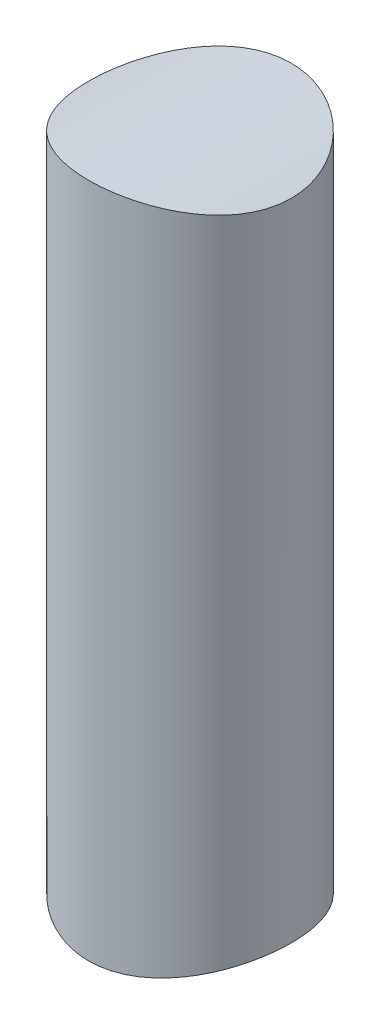
ISO-10303-21;
HEADER;
FILE_DESCRIPTION(('STEP AP214'),'2;1');
FILE_NAME('part.step','',(''),(''),'','','');
FILE_SCHEMA(('AUTOMOTIVE_DESIGN { 1 0 10303 214 1 1 1 1 }'));
ENDSEC;
DATA;
#1=APPLICATION_CONTEXT('core data for automotive mechanical design processes');
#2=APPLICATION_PROTOCOL_DEFINITION('international standard','automotive_design',2000,#1);
#3=PRODUCT_CONTEXT('',#1,'mechanical');
#4=PRODUCT('Part','Part','',(#3));
#5=PRODUCT_RELATED_PRODUCT_CATEGORY('part','',(#4));
#6=PRODUCT_DEFINITION_FORMATION('','',#4);
#7=PRODUCT_DEFINITION_CONTEXT('part definition',#1,'design');
#8=PRODUCT_DEFINITION('design','',#6,#7);
#9=PRODUCT_DEFINITION_SHAPE('','',#8);
#10=(LENGTH_UNIT() NAMED_UNIT(*) SI_UNIT(.MILLI.,.METRE.));
#11=(NAMED_UNIT(*) PLANE_ANGLE_UNIT() SI_UNIT($,.RADIAN.));
#12=(NAMED_UNIT(*) SI_UNIT($,.STERADIAN.) SOLID_ANGLE_UNIT());
#13=UNCERTAINTY_MEASURE_WITH_UNIT(LENGTH_MEASURE(1.E-05),#10,'distance_accuracy_value','');
#14=(GEOMETRIC_REPRESENTATION_CONTEXT(3) GLOBAL_UNCERTAINTY_ASSIGNED_CONTEXT((#13)) GLOBAL_UNIT_ASSIGNED_CONTEXT((#10,
#11,#12)) REPRESENTATION_CONTEXT('',''));
#15=CARTESIAN_POINT('',(0.,0.,0.));
#16=DIRECTION('',(0.,0.,1.));
#17=DIRECTION('',(1.,0.,0.));
#18=AXIS2_PLACEMENT_3D('',#15,#16,#17);
#19=CARTESIAN_POINT('',(0.,0.,5.));
#20=DIRECTION('',(0.,0.,-1.));
#21=DIRECTION('',(-1.,0.,0.));
#22=AXIS2_PLACEMENT_3D('',#19,#20,#21);
#23=CYLINDRICAL_SURFACE('',#22,2.5);
#24=CARTESIAN_POINT('',(0.,2.5,3.25));
#25=CARTESIAN_POINT('',(-0.04114430637665,2.49999964625275,3.24999950125756));
#26=CARTESIAN_POINT('',(-0.0822936591757648,2.49897457846979,3.24660306818802));
#27=CARTESIAN_POINT('',(-0.16339406265244,2.49498552796844,3.23313932288895));
#28=CARTESIAN_POINT('',(-0.20334475220571,2.49202096694839,3.22307002098833));
#29=CARTESIAN_POINT('',(-0.280866353877264,2.48447776250925,3.19662699154487));
#30=CARTESIAN_POINT('',(-0.318440682197688,2.47990150125239,3.18026256519052));
#31=CARTESIAN_POINT('',(-0.390312090526564,2.46961054618796,3.14173195347209));
#32=CARTESIAN_POINT('',(-0.42460873373483,2.46389570095935,3.11956499630233));
#33=CARTESIAN_POINT('',(-0.489935898591878,2.45175368596488,3.06938799626363));
#34=CARTESIAN_POINT('',(-0.52085903562219,2.445311918289,3.0412416870569));
#35=CARTESIAN_POINT('',(-0.577624604616599,2.43252917104839,2.98019538504505));
#36=CARTESIAN_POINT('',(-0.603466181637131,2.42618820860824,2.94729459393805));
#37=CARTESIAN_POINT('',(-0.649900188618613,2.41417056998345,2.87676462348066));
#38=CARTESIAN_POINT('',(-0.67036154511135,2.4085120333744,2.8390457695026));
#39=CARTESIAN_POINT('',(-0.704606973873519,2.39871810191514,2.76050537288688));
#40=CARTESIAN_POINT('',(-0.71839264959881,2.39458234136111,2.71968457804358));
#41=CARTESIAN_POINT('',(-0.738508168412816,2.38845435439231,2.63730486693343));
#42=CARTESIAN_POINT('',(-0.745035981175235,2.38640534735888,2.59579862805323));
#43=CARTESIAN_POINT('',(-0.751068653075396,2.38451394948142,2.51223342187363));
#44=CARTESIAN_POINT('',(-0.750575213805359,2.38467102399598,2.47017459096274));
#45=CARTESIAN_POINT('',(-0.742734885998503,2.38712372015292,2.38830804569707));
#46=CARTESIAN_POINT('',(-0.735636026313277,2.38934194294585,2.34847387481923));
#47=CARTESIAN_POINT('',(-0.715187102135428,2.39554178119298,2.27059010686292));
#48=CARTESIAN_POINT('',(-0.701836420708244,2.3995235706752,2.23254068631274));
#49=CARTESIAN_POINT('',(-0.669080133268367,2.40886366536124,2.15869982516973));
#50=CARTESIAN_POINT('',(-0.649594084673201,2.4142400805761,2.12294645802239));
#51=CARTESIAN_POINT('',(-0.605176112943427,2.42575493500398,2.05513398899488));
#52=CARTESIAN_POINT('',(-0.580242870012945,2.43189355873595,2.0230757852931));
#53=CARTESIAN_POINT('',(-0.524406453827728,2.44455505648865,1.962156904619));
#54=CARTESIAN_POINT('',(-0.493297453733485,2.45108327155221,1.93348566798517));
#55=CARTESIAN_POINT('',(-0.426631629656984,2.46356122031657,1.88172300796787));
#56=CARTESIAN_POINT('',(-0.391074525930444,2.46951091759212,1.85863193579279));
#57=CARTESIAN_POINT('',(-0.316177519171401,2.48021580034728,1.81857003876763));
#58=CARTESIAN_POINT('',(-0.276813874873975,2.48496271834155,1.80164124187507));
#59=CARTESIAN_POINT('',(-0.19562270780176,2.49266760916113,1.77470020495018));
#60=CARTESIAN_POINT('',(-0.153795875794791,2.495626080935,1.76468603573375));
#61=CARTESIAN_POINT('',(-0.0704761213341656,2.49934182321769,1.7521739110503));
#62=CARTESIAN_POINT('',(-0.029025048800593,2.50017425208896,1.7494192070992));
#63=CARTESIAN_POINT('',(0.0537498029116911,2.49976461620879,1.75078457785604));
#64=CARTESIAN_POINT('',(0.0950735983453889,2.49852282838873,1.75490373482572));
#65=CARTESIAN_POINT('',(0.17545180265485,2.49415348493587,1.76969230555575));
#66=CARTESIAN_POINT('',(0.21453638630709,2.49106914899727,1.78021169379045));
#67=CARTESIAN_POINT('',(0.290377319477255,2.48337173920747,1.80732161638909));
#68=CARTESIAN_POINT('',(0.327133388512771,2.47875848160472,1.82391288051888));
#69=CARTESIAN_POINT('',(0.398218594730547,2.46834827175735,1.86312658274062));
#70=CARTESIAN_POINT('',(0.432471913099914,2.4625264041511,1.8858796704742));
#71=CARTESIAN_POINT('',(0.496761653989994,2.45036734381886,1.9366123770262));
#72=CARTESIAN_POINT('',(0.526797016177672,2.44403002214522,1.96459330594305));
#73=CARTESIAN_POINT('',(0.58292872275544,2.43126585935624,2.02619365418548));
#74=CARTESIAN_POINT('',(0.608842406158679,2.42484412520639,2.05998093788894));
#75=CARTESIAN_POINT('',(0.654644975359606,2.41288257615227,2.13156396950369));
#76=CARTESIAN_POINT('',(0.67453401914302,2.40734273812361,2.16935961226761));
#77=CARTESIAN_POINT('',(0.707586735638617,2.39783594822466,2.24776624563512));
#78=CARTESIAN_POINT('',(0.720781734698862,2.39386168977456,2.2883630933033));
#79=CARTESIAN_POINT('',(0.740108654089556,2.38795797236724,2.37134398450277));
#80=CARTESIAN_POINT('',(0.746242994897492,2.38602781268684,2.41372741040567));
#81=CARTESIAN_POINT('',(0.751109922422095,2.38449986234108,2.497180759181));
#82=CARTESIAN_POINT('',(0.750140276541593,2.38480823717645,2.53823182550689));
#83=CARTESIAN_POINT('',(0.741537527224924,2.38749700647879,2.6195570516883));
#84=CARTESIAN_POINT('',(0.733904690623809,2.3898773179727,2.65983124258868));
#85=CARTESIAN_POINT('',(0.712384444020455,2.39637881834211,2.73797269957092));
#86=CARTESIAN_POINT('',(0.698575877535282,2.40047802272719,2.77586364368071));
#87=CARTESIAN_POINT('',(0.665157535605707,2.40995139454832,2.848821219409));
#88=CARTESIAN_POINT('',(0.645546649814398,2.41532580597228,2.88388730882042));
#89=CARTESIAN_POINT('',(0.600243819025343,2.42698838212842,2.95158155826352));
#90=CARTESIAN_POINT('',(0.574356380464964,2.43330270081879,2.9840743806302));
#91=CARTESIAN_POINT('',(0.517587173148914,2.44600660225033,3.04435124915394));
#92=CARTESIAN_POINT('',(0.486704108567252,2.45239620411958,3.07213406973388));
#93=CARTESIAN_POINT('',(0.419732881091623,2.46475468285319,3.12301170614751));
#94=CARTESIAN_POINT('',(0.383518942895303,2.47070579882836,3.14594572342774));
#95=CARTESIAN_POINT('',(0.307570686991765,2.48130340227908,3.18536758495201));
#96=CARTESIAN_POINT('',(0.267838026499477,2.48595049965534,3.20185844413726));
#97=CARTESIAN_POINT('',(0.19037885632764,2.4930108748465,3.22644763782638));
#98=CARTESIAN_POINT('',(0.152893480977116,2.49561013690534,3.23525583644162));
#99=CARTESIAN_POINT('',(0.0769400976153893,2.49910472247246,3.24703176262079));
#100=CARTESIAN_POINT('',(0.0384722549290696,2.5000003307737,3.25000046635241));
#101=CARTESIAN_POINT('',(0.,2.5,3.25));
#102=B_SPLINE_CURVE_WITH_KNOTS('',3,(#24,#25,#26,#27,#28,#29,#30,#31,#32,#33,#34,#35,#36,#37,
#38,#39,#40,#41,#42,#43,#44,#45,#46,#47,#48,#49,#50,#51,#52,#53,#54,#55,#56,#57,#58,#59,#60,#61,
#62,#63,#64,#65,#66,#67,#68,#69,#70,#71,#72,#73,#74,#75,#76,#77,#78,#79,#80,#81,#82,#83,#84,#85,
#86,#87,#88,#89,#90,#91,#92,#93,#94,#95,#96,#97,#98,#99,#100,#101),.UNSPECIFIED.,.T.,.F.,(4,2,2,
2,2,2,2,2,2,2,2,2,2,2,2,2,2,2,2,2,2,2,2,2,2,2,2,2,2,2,2,2,2,2,2,2,2,2,4),(0.,0.123291601806305,
0.246619982423,0.369766838150437,0.492930082206351,0.619278014740958,0.745647186443165,
0.874857405020545,1.00403657271612,1.12959844676438,1.25512989155768,1.37613008345061,
1.49714221825224,1.61981213219783,1.74251180075501,1.87033552020306,1.99816728261759,
2.12685523437067,2.25550726760627,2.37954404715496,2.50356426771387,2.62478373337387,
2.74601777293087,2.87005652847677,2.99412640996319,3.12270200157632,3.25127422122563,
3.37923907470651,3.50716004723841,3.6297507772717,3.75233659824499,3.8734002019506,
3.99448698770253,4.11998462833664,4.2455148744245,4.37471498072034,4.50385455791317,
4.61915845958929,4.73444308468136),.UNSPECIFIED.);
#103=CARTESIAN_POINT('',(0.,2.5,3.25));
#104=VERTEX_POINT('',#103);
#105=EDGE_CURVE('E46',#104,#104,#102,.T.);
#106=ORIENTED_EDGE('',*,*,#105,.F.);
#107=EDGE_LOOP('',(#106));
#108=FACE_BOUND('',#107,.T.);
#109=ADVANCED_FACE('F35',(#108),#23,.T.);
#110=CARTESIAN_POINT('',(0.,-2.5,2.5));
#111=DIRECTION('',(0.,1.,0.));
#112=DIRECTION('',(0.,0.,1.));
#113=AXIS2_PLACEMENT_3D('',#110,#111,#112);
#114=CYLINDRICAL_SURFACE('',#113,0.75);
#115=ORIENTED_EDGE('',*,*,#105,.T.);
#116=EDGE_LOOP('',(#115));
#117=FACE_BOUND('',#116,.T.);
#118=CARTESIAN_POINT('',(0.,-2.5,3.25));
#119=CARTESIAN_POINT('',(0.04114430637665,-2.49999964625275,3.24999950125756));
#120=CARTESIAN_POINT('',(0.0822936591757648,-2.49897457846979,3.24660306818802));
#121=CARTESIAN_POINT('',(0.16339406265244,-2.49498552796844,3.23313932288895));
#122=CARTESIAN_POINT('',(0.20334475220571,-2.49202096694839,3.22307002098833));
#123=CARTESIAN_POINT('',(0.280866353877264,-2.48447776250925,3.19662699154487));
#124=CARTESIAN_POINT('',(0.318440682197688,-2.47990150125239,3.18026256519052));
#125=CARTESIAN_POINT('',(0.390312090526564,-2.46961054618796,3.14173195347209));
#126=CARTESIAN_POINT('',(0.42460873373483,-2.46389570095935,3.11956499630233));
#127=CARTESIAN_POINT('',(0.489935898591878,-2.45175368596488,3.06938799626363));
#128=CARTESIAN_POINT('',(0.52085903562219,-2.445311918289,3.0412416870569));
#129=CARTESIAN_POINT('',(0.577624604616599,-2.43252917104839,2.98019538504505));
#130=CARTESIAN_POINT('',(0.603466181637131,-2.42618820860824,2.94729459393805));
#131=CARTESIAN_POINT('',(0.649900188618613,-2.41417056998345,2.87676462348066));
#132=CARTESIAN_POINT('',(0.67036154511135,-2.4085120333744,2.8390457695026));
#133=CARTESIAN_POINT('',(0.704606973873519,-2.39871810191514,2.76050537288688));
#134=CARTESIAN_POINT('',(0.71839264959881,-2.39458234136111,2.71968457804358));
#135=CARTESIAN_POINT('',(0.738508168412816,-2.38845435439231,2.63730486693343));
#136=CARTESIAN_POINT('',(0.745035981175235,-2.38640534735888,2.59579862805323));
#137=CARTESIAN_POINT('',(0.751068653075396,-2.38451394948142,2.51223342187363));
#138=CARTESIAN_POINT('',(0.750575213805359,-2.38467102399598,2.47017459096274));
#139=CARTESIAN_POINT('',(0.742734885998503,-2.38712372015292,2.38830804569707));
#140=CARTESIAN_POINT('',(0.735636026313277,-2.38934194294585,2.34847387481923));
#141=CARTESIAN_POINT('',(0.715187102135428,-2.39554178119298,2.27059010686292));
#142=CARTESIAN_POINT('',(0.701836420708244,-2.3995235706752,2.23254068631274));
#143=CARTESIAN_POINT('',(0.669080133268367,-2.40886366536124,2.15869982516973));
#144=CARTESIAN_POINT('',(0.649594084673201,-2.4142400805761,2.12294645802239));
#145=CARTESIAN_POINT('',(0.605176112943427,-2.42575493500398,2.05513398899488));
#146=CARTESIAN_POINT('',(0.580242870012945,-2.43189355873595,2.0230757852931));
#147=CARTESIAN_POINT('',(0.524406453827728,-2.44455505648865,1.962156904619));
#148=CARTESIAN_POINT('',(0.493297453733485,-2.45108327155221,1.93348566798517));
#149=CARTESIAN_POINT('',(0.426631629656984,-2.46356122031657,1.88172300796787));
#150=CARTESIAN_POINT('',(0.391074525930444,-2.46951091759212,1.85863193579279));
#151=CARTESIAN_POINT('',(0.316177519171401,-2.48021580034728,1.81857003876763));
#152=CARTESIAN_POINT('',(0.276813874873975,-2.48496271834155,1.80164124187507));
#153=CARTESIAN_POINT('',(0.19562270780176,-2.49266760916113,1.77470020495018));
#154=CARTESIAN_POINT('',(0.153795875794791,-2.495626080935,1.76468603573375));
#155=CARTESIAN_POINT('',(0.0704761213341656,-2.49934182321769,1.7521739110503));
#156=CARTESIAN_POINT('',(0.029025048800593,-2.50017425208896,1.7494192070992));
#157=CARTESIAN_POINT('',(-0.0537498029116911,-2.49976461620879,1.75078457785604));
#158=CARTESIAN_POINT('',(-0.0950735983453889,-2.49852282838873,1.75490373482572));
#159=CARTESIAN_POINT('',(-0.17545180265485,-2.49415348493587,1.76969230555575));
#160=CARTESIAN_POINT('',(-0.21453638630709,-2.49106914899727,1.78021169379045));
#161=CARTESIAN_POINT('',(-0.290377319477255,-2.48337173920747,1.80732161638909));
#162=CARTESIAN_POINT('',(-0.327133388512771,-2.47875848160472,1.82391288051888));
#163=CARTESIAN_POINT('',(-0.398218594730547,-2.46834827175735,1.86312658274062));
#164=CARTESIAN_POINT('',(-0.432471913099914,-2.4625264041511,1.8858796704742));
#165=CARTESIAN_POINT('',(-0.496761653989994,-2.45036734381886,1.9366123770262));
#166=CARTESIAN_POINT('',(-0.526797016177672,-2.44403002214522,1.96459330594305));
#167=CARTESIAN_POINT('',(-0.58292872275544,-2.43126585935624,2.02619365418548));
#168=CARTESIAN_POINT('',(-0.608842406158679,-2.42484412520639,2.05998093788894));
#169=CARTESIAN_POINT('',(-0.654644975359606,-2.41288257615227,2.13156396950369));
#170=CARTESIAN_POINT('',(-0.67453401914302,-2.40734273812361,2.16935961226761));
#171=CARTESIAN_POINT('',(-0.707586735638617,-2.39783594822466,2.24776624563512));
#172=CARTESIAN_POINT('',(-0.720781734698862,-2.39386168977456,2.2883630933033));
#173=CARTESIAN_POINT('',(-0.740108654089556,-2.38795797236724,2.37134398450277));
#174=CARTESIAN_POINT('',(-0.746242994897492,-2.38602781268684,2.41372741040567));
#175=CARTESIAN_POINT('',(-0.751109922422095,-2.38449986234108,2.497180759181));
#176=CARTESIAN_POINT('',(-0.750140276541593,-2.38480823717645,2.53823182550689));
#177=CARTESIAN_POINT('',(-0.741537527224924,-2.38749700647879,2.6195570516883));
#178=CARTESIAN_POINT('',(-0.733904690623809,-2.3898773179727,2.65983124258868));
#179=CARTESIAN_POINT('',(-0.712384444020455,-2.39637881834211,2.73797269957092));
#180=CARTESIAN_POINT('',(-0.698575877535282,-2.40047802272719,2.77586364368071));
#181=CARTESIAN_POINT('',(-0.665157535605707,-2.40995139454832,2.848821219409));
#182=CARTESIAN_POINT('',(-0.645546649814398,-2.41532580597228,2.88388730882042));
#183=CARTESIAN_POINT('',(-0.600243819025343,-2.42698838212842,2.95158155826352));
#184=CARTESIAN_POINT('',(-0.574356380464964,-2.43330270081879,2.9840743806302));
#185=CARTESIAN_POINT('',(-0.517587173148914,-2.44600660225033,3.04435124915394));
#186=CARTESIAN_POINT('',(-0.486704108567252,-2.45239620411958,3.07213406973388));
#187=CARTESIAN_POINT('',(-0.419732881091623,-2.46475468285319,3.12301170614751));
#188=CARTESIAN_POINT('',(-0.383518942895303,-2.47070579882836,3.14594572342774));
#189=CARTESIAN_POINT('',(-0.307570686991765,-2.48130340227908,3.18536758495201));
#190=CARTESIAN_POINT('',(-0.267838026499477,-2.48595049965534,3.20185844413726));
#191=CARTESIAN_POINT('',(-0.19037885632764,-2.4930108748465,3.22644763782638));
#192=CARTESIAN_POINT('',(-0.152893480977116,-2.49561013690534,3.23525583644162));
#193=CARTESIAN_POINT('',(-0.0769400976153893,-2.49910472247246,3.24703176262079));
#194=CARTESIAN_POINT('',(-0.0384722549290696,-2.5000003307737,3.25000046635241));
#195=CARTESIAN_POINT('',(0.,-2.5,3.25));
#196=B_SPLINE_CURVE_WITH_KNOTS('',3,(#118,#119,#120,#121,#122,#123,#124,#125,#126,#127,#128,
#129,#130,#131,#132,#133,#134,#135,#136,#137,#138,#139,#140,#141,#142,#143,#144,#145,#146,#147,
#148,#149,#150,#151,#152,#153,#154,#155,#156,#157,#158,#159,#160,#161,#162,#163,#164,#165,#166,
#167,#168,#169,#170,#171,#172,#173,#174,#175,#176,#177,#178,#179,#180,#181,#182,#183,#184,#185,
#186,#187,#188,#189,#190,#191,#192,#193,#194,#195),.UNSPECIFIED.,.T.,.F.,(4,2,2,2,2,2,2,2,2,2,2,
2,2,2,2,2,2,2,2,2,2,2,2,2,2,2,2,2,2,2,2,2,2,2,2,2,2,2,4),(0.,0.123291601806305,0.246619982423,
0.369766838150437,0.492930082206351,0.619278014740958,0.745647186443165,0.874857405020545,
1.00403657271612,1.12959844676438,1.25512989155768,1.37613008345061,1.49714221825224,
1.61981213219783,1.74251180075501,1.87033552020306,1.99816728261759,2.12685523437067,
2.25550726760627,2.37954404715496,2.50356426771387,2.62478373337387,2.74601777293087,
2.87005652847677,2.99412640996319,3.12270200157632,3.25127422122563,3.37923907470651,
3.50716004723841,3.6297507772717,3.75233659824499,3.8734002019506,3.99448698770253,
4.11998462833664,4.2455148744245,4.37471498072034,4.50385455791317,4.61915845958929,
4.73444308468136),.UNSPECIFIED.);
#197=CARTESIAN_POINT('',(0.,-2.5,3.25));
#198=VERTEX_POINT('',#197);
#199=EDGE_CURVE('E11',#198,#198,#196,.T.);
#200=ORIENTED_EDGE('',*,*,#199,.T.);
#201=EDGE_LOOP('',(#200));
#202=FACE_BOUND('',#201,.T.);
#203=ADVANCED_FACE('F55',(#117,#202),#114,.T.);
#204=ORIENTED_EDGE('',*,*,#199,.F.);
#205=EDGE_LOOP('',(#204));
#206=FACE_BOUND('',#205,.T.);
#207=ADVANCED_FACE('F37',(#206),#23,.T.);
#208=CLOSED_SHELL('',(#109,#203,#207));
#209=MANIFOLD_SOLID_BREP('B2',#208);
#210=ADVANCED_BREP_SHAPE_REPRESENTATION('',(#18,#209),#14);
#211=SHAPE_DEFINITION_REPRESENTATION(#9,#210);
ENDSEC;
END-ISO-10303-21;
